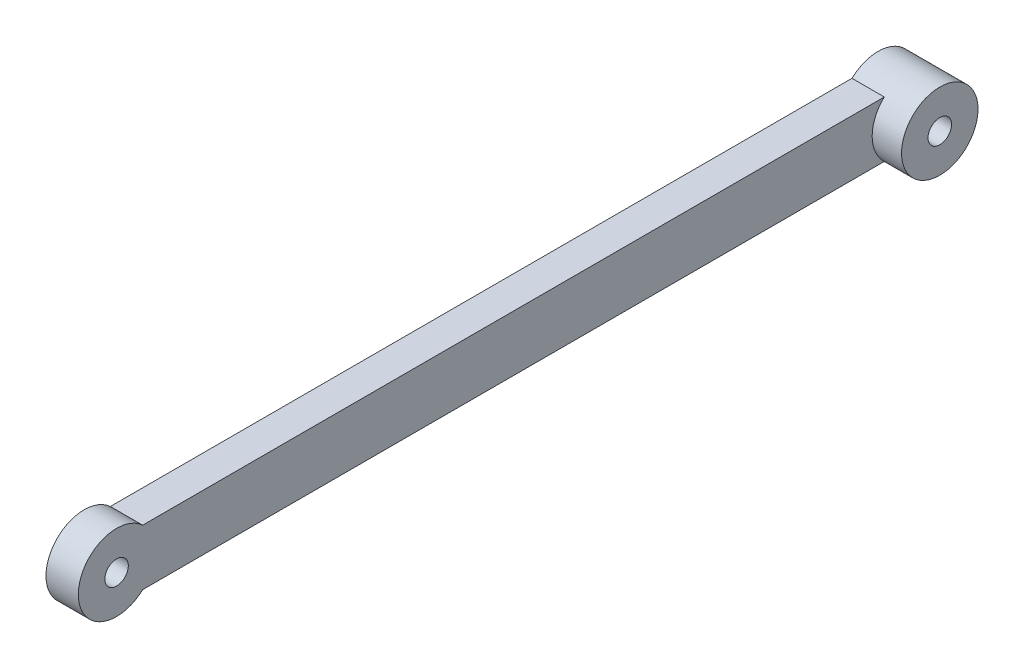
ISO-10303-21;
HEADER;
FILE_DESCRIPTION(('STEP AP214'),'2;1');
FILE_NAME('part.step','',(''),(''),'','','');
FILE_SCHEMA(('AUTOMOTIVE_DESIGN { 1 0 10303 214 1 1 1 1 }'));
ENDSEC;
DATA;
#1=APPLICATION_CONTEXT('core data for automotive mechanical design processes');
#2=APPLICATION_PROTOCOL_DEFINITION('international standard','automotive_design',2000,#1);
#3=PRODUCT_CONTEXT('',#1,'mechanical');
#4=PRODUCT('Part','Part','',(#3));
#5=PRODUCT_RELATED_PRODUCT_CATEGORY('part','',(#4));
#6=PRODUCT_DEFINITION_FORMATION('','',#4);
#7=PRODUCT_DEFINITION_CONTEXT('part definition',#1,'design');
#8=PRODUCT_DEFINITION('design','',#6,#7);
#9=PRODUCT_DEFINITION_SHAPE('','',#8);
#10=(LENGTH_UNIT() NAMED_UNIT(*) SI_UNIT(.MILLI.,.METRE.));
#11=(NAMED_UNIT(*) PLANE_ANGLE_UNIT() SI_UNIT($,.RADIAN.));
#12=(NAMED_UNIT(*) SI_UNIT($,.STERADIAN.) SOLID_ANGLE_UNIT());
#13=UNCERTAINTY_MEASURE_WITH_UNIT(LENGTH_MEASURE(1.E-05),#10,'distance_accuracy_value','');
#14=(GEOMETRIC_REPRESENTATION_CONTEXT(3) GLOBAL_UNCERTAINTY_ASSIGNED_CONTEXT((#13)) GLOBAL_UNIT_ASSIGNED_CONTEXT((#10,
#11,#12)) REPRESENTATION_CONTEXT('',''));
#15=CARTESIAN_POINT('',(0.,0.,0.));
#16=DIRECTION('',(0.,0.,1.));
#17=DIRECTION('',(1.,0.,0.));
#18=AXIS2_PLACEMENT_3D('',#15,#16,#17);
#19=CARTESIAN_POINT('',(5.5,0.,-135.));
#20=DIRECTION('',(1.,0.,0.));
#21=DIRECTION('',(0.,0.,-1.));
#22=AXIS2_PLACEMENT_3D('',#19,#20,#21);
#23=PLANE('',#22);
#24=CARTESIAN_POINT('',(5.5,0.,-135.));
#25=DIRECTION('',(1.,0.,0.));
#26=DIRECTION('',(0.,0.,-1.));
#27=AXIS2_PLACEMENT_3D('',#24,#25,#26);
#28=CIRCLE('',#27,6.50000000000002);
#29=CARTESIAN_POINT('',(5.5,4.75000000000001,-130.562940162675));
#30=VERTEX_POINT('',#29);
#31=CARTESIAN_POINT('',(5.5,-4.75,-130.562940162675));
#32=VERTEX_POINT('',#31);
#33=EDGE_CURVE('E85',#30,#32,#28,.T.);
#34=ORIENTED_EDGE('',*,*,#33,.F.);
#35=DIRECTION('',(0.,0.,1.));
#36=VECTOR('',#35,1.);
#37=CARTESIAN_POINT('',(5.5,4.75,-4.43705983732471));
#38=LINE('',#37,#36);
#39=CARTESIAN_POINT('',(5.5,4.75,-4.43705983732471));
#40=VERTEX_POINT('',#39);
#41=EDGE_CURVE('E77',#30,#40,#38,.T.);
#42=ORIENTED_EDGE('',*,*,#41,.T.);
#43=CARTESIAN_POINT('',(5.5,0.,0.));
#44=DIRECTION('',(1.,0.,0.));
#45=DIRECTION('',(0.,0.,-1.));
#46=AXIS2_PLACEMENT_3D('',#43,#44,#45);
#47=CIRCLE('',#46,6.5);
#48=CARTESIAN_POINT('',(5.5,-4.75,-4.43705983732471));
#49=VERTEX_POINT('',#48);
#50=EDGE_CURVE('E91',#40,#49,#47,.T.);
#51=ORIENTED_EDGE('',*,*,#50,.T.);
#52=DIRECTION('',(0.,0.,-1.));
#53=VECTOR('',#52,1.);
#54=CARTESIAN_POINT('',(5.5,-4.75,-4.43705983732471));
#55=LINE('',#54,#53);
#56=EDGE_CURVE('E50',#49,#32,#55,.T.);
#57=ORIENTED_EDGE('',*,*,#56,.T.);
#58=EDGE_LOOP('',(#34,#42,#51,#57));
#59=FACE_BOUND('',#58,.T.);
#60=CARTESIAN_POINT('',(5.5,0.,0.));
#61=DIRECTION('',(1.,0.,0.));
#62=DIRECTION('',(0.,0.,-1.));
#63=AXIS2_PLACEMENT_3D('',#60,#61,#62);
#64=CIRCLE('',#63,2.);
#65=CARTESIAN_POINT('',(5.5,0.,-2.));
#66=VERTEX_POINT('',#65);
#67=EDGE_CURVE('E106',#66,#66,#64,.T.);
#68=ORIENTED_EDGE('',*,*,#67,.F.);
#69=EDGE_LOOP('',(#68));
#70=FACE_BOUND('',#69,.T.);
#71=ADVANCED_FACE('F33',(#59,#70),#23,.T.);
#72=CARTESIAN_POINT('',(0.,0.,-135.));
#73=DIRECTION('',(1.,0.,0.));
#74=DIRECTION('',(0.,0.,-1.));
#75=AXIS2_PLACEMENT_3D('',#72,#73,#74);
#76=PLANE('',#75);
#77=CARTESIAN_POINT('',(0.,0.,-135.));
#78=DIRECTION('',(1.,0.,0.));
#79=DIRECTION('',(0.,0.,-1.));
#80=AXIS2_PLACEMENT_3D('',#77,#78,#79);
#81=CIRCLE('',#80,6.49999999999999);
#82=CARTESIAN_POINT('',(0.,-4.75,-130.562940162675));
#83=VERTEX_POINT('',#82);
#84=CARTESIAN_POINT('',(0.,4.75,-130.562940162675));
#85=VERTEX_POINT('',#84);
#86=EDGE_CURVE('E87',#83,#85,#81,.T.);
#87=ORIENTED_EDGE('',*,*,#86,.F.);
#88=DIRECTION('',(0.,0.,-1.));
#89=VECTOR('',#88,1.);
#90=CARTESIAN_POINT('',(0.,-4.75,-4.43705983732471));
#91=LINE('',#90,#89);
#92=CARTESIAN_POINT('',(0.,-4.75,-4.43705983732471));
#93=VERTEX_POINT('',#92);
#94=EDGE_CURVE('E73',#93,#83,#91,.T.);
#95=ORIENTED_EDGE('',*,*,#94,.F.);
#96=CARTESIAN_POINT('',(0.,0.,0.));
#97=DIRECTION('',(1.,0.,0.));
#98=DIRECTION('',(0.,0.,-1.));
#99=AXIS2_PLACEMENT_3D('',#96,#97,#98);
#100=CIRCLE('',#99,6.5);
#101=CARTESIAN_POINT('',(0.,4.75,-4.43705983732471));
#102=VERTEX_POINT('',#101);
#103=EDGE_CURVE('E68',#102,#93,#100,.T.);
#104=ORIENTED_EDGE('',*,*,#103,.F.);
#105=DIRECTION('',(0.,0.,1.));
#106=VECTOR('',#105,1.);
#107=CARTESIAN_POINT('',(0.,4.75,-4.43705983732471));
#108=LINE('',#107,#106);
#109=EDGE_CURVE('E115',#85,#102,#108,.T.);
#110=ORIENTED_EDGE('',*,*,#109,.F.);
#111=EDGE_LOOP('',(#87,#95,#104,#110));
#112=FACE_BOUND('',#111,.T.);
#113=CARTESIAN_POINT('',(0.,0.,0.));
#114=DIRECTION('',(1.,0.,0.));
#115=DIRECTION('',(0.,0.,-1.));
#116=AXIS2_PLACEMENT_3D('',#113,#114,#115);
#117=CIRCLE('',#116,2.);
#118=CARTESIAN_POINT('',(0.,0.,-2.));
#119=VERTEX_POINT('',#118);
#120=EDGE_CURVE('E105',#119,#119,#117,.T.);
#121=ORIENTED_EDGE('',*,*,#120,.T.);
#122=EDGE_LOOP('',(#121));
#123=FACE_BOUND('',#122,.T.);
#124=CARTESIAN_POINT('',(0.,0.,-135.));
#125=DIRECTION('',(1.,0.,0.));
#126=DIRECTION('',(0.,0.,-1.));
#127=AXIS2_PLACEMENT_3D('',#124,#125,#126);
#128=CIRCLE('',#127,2.);
#129=CARTESIAN_POINT('',(0.,0.,-137.));
#130=VERTEX_POINT('',#129);
#131=EDGE_CURVE('E98',#130,#130,#128,.T.);
#132=ORIENTED_EDGE('',*,*,#131,.T.);
#133=EDGE_LOOP('',(#132));
#134=FACE_BOUND('',#133,.T.);
#135=ADVANCED_FACE('F123',(#112,#123,#134),#76,.F.);
#136=CARTESIAN_POINT('',(5.5,0.,-135.));
#137=DIRECTION('',(-1.,0.,0.));
#138=DIRECTION('',(0.,0.,1.));
#139=AXIS2_PLACEMENT_3D('',#136,#137,#138);
#140=CYLINDRICAL_SURFACE('',#139,6.49999999999999);
#141=ORIENTED_EDGE('',*,*,#86,.T.);
#142=DIRECTION('',(-1.,0.,0.));
#143=VECTOR('',#142,1.);
#144=CARTESIAN_POINT('',(5.5,4.75,-130.562940162675));
#145=LINE('',#144,#143);
#146=EDGE_CURVE('E11',#30,#85,#145,.T.);
#147=ORIENTED_EDGE('',*,*,#146,.F.);
#148=ORIENTED_EDGE('',*,*,#33,.T.);
#149=DIRECTION('',(-1.,0.,0.));
#150=VECTOR('',#149,1.);
#151=CARTESIAN_POINT('',(5.5,-4.75,-130.562940162675));
#152=LINE('',#151,#150);
#153=EDGE_CURVE('E113',#32,#83,#152,.T.);
#154=ORIENTED_EDGE('',*,*,#153,.T.);
#155=EDGE_LOOP('',(#141,#147,#148,#154));
#156=FACE_BOUND('',#155,.T.);
#157=CARTESIAN_POINT('',(10.5,0.,-135.));
#158=DIRECTION('',(1.,0.,0.));
#159=DIRECTION('',(0.,0.,-1.));
#160=AXIS2_PLACEMENT_3D('',#157,#158,#159);
#161=CIRCLE('',#160,6.50000000000002);
#162=CARTESIAN_POINT('',(10.5,0.,-141.5));
#163=VERTEX_POINT('',#162);
#164=EDGE_CURVE('E94',#163,#163,#161,.T.);
#165=ORIENTED_EDGE('',*,*,#164,.F.);
#166=EDGE_LOOP('',(#165));
#167=FACE_BOUND('',#166,.T.);
#168=ADVANCED_FACE('F35',(#156,#167),#140,.T.);
#169=CARTESIAN_POINT('',(5.5,4.75,-4.43705983732471));
#170=DIRECTION('',(0.,-1.,0.));
#171=DIRECTION('',(0.,0.,-1.));
#172=AXIS2_PLACEMENT_3D('',#169,#170,#171);
#173=PLANE('',#172);
#174=ORIENTED_EDGE('',*,*,#109,.T.);
#175=DIRECTION('',(-1.,0.,0.));
#176=VECTOR('',#175,1.);
#177=CARTESIAN_POINT('',(5.5,4.75,-4.43705983732471));
#178=LINE('',#177,#176);
#179=EDGE_CURVE('E42',#40,#102,#178,.T.);
#180=ORIENTED_EDGE('',*,*,#179,.F.);
#181=ORIENTED_EDGE('',*,*,#41,.F.);
#182=ORIENTED_EDGE('',*,*,#146,.T.);
#183=EDGE_LOOP('',(#174,#180,#181,#182));
#184=FACE_BOUND('',#183,.T.);
#185=ADVANCED_FACE('F89',(#184),#173,.F.);
#186=CARTESIAN_POINT('',(5.5,0.,0.));
#187=DIRECTION('',(-1.,0.,0.));
#188=DIRECTION('',(0.,0.,1.));
#189=AXIS2_PLACEMENT_3D('',#186,#187,#188);
#190=CYLINDRICAL_SURFACE('',#189,6.5);
#191=ORIENTED_EDGE('',*,*,#103,.T.);
#192=DIRECTION('',(-1.,0.,0.));
#193=VECTOR('',#192,1.);
#194=CARTESIAN_POINT('',(5.5,-4.75,-4.43705983732471));
#195=LINE('',#194,#193);
#196=EDGE_CURVE('E120',#49,#93,#195,.T.);
#197=ORIENTED_EDGE('',*,*,#196,.F.);
#198=ORIENTED_EDGE('',*,*,#50,.F.);
#199=ORIENTED_EDGE('',*,*,#179,.T.);
#200=EDGE_LOOP('',(#191,#197,#198,#199));
#201=FACE_BOUND('',#200,.T.);
#202=ADVANCED_FACE('F121',(#201),#190,.T.);
#203=CARTESIAN_POINT('',(5.5,-4.75,-4.43705983732471));
#204=DIRECTION('',(0.,1.,0.));
#205=DIRECTION('',(0.,0.,1.));
#206=AXIS2_PLACEMENT_3D('',#203,#204,#205);
#207=PLANE('',#206);
#208=ORIENTED_EDGE('',*,*,#94,.T.);
#209=ORIENTED_EDGE('',*,*,#153,.F.);
#210=ORIENTED_EDGE('',*,*,#56,.F.);
#211=ORIENTED_EDGE('',*,*,#196,.T.);
#212=EDGE_LOOP('',(#208,#209,#210,#211));
#213=FACE_BOUND('',#212,.T.);
#214=ADVANCED_FACE('F150',(#213),#207,.F.);
#215=CARTESIAN_POINT('',(5.5,0.,0.));
#216=DIRECTION('',(-1.,0.,0.));
#217=DIRECTION('',(0.,0.,1.));
#218=AXIS2_PLACEMENT_3D('',#215,#216,#217);
#219=CYLINDRICAL_SURFACE('',#218,2.);
#220=ORIENTED_EDGE('',*,*,#67,.T.);
#221=EDGE_LOOP('',(#220));
#222=FACE_BOUND('',#221,.T.);
#223=ORIENTED_EDGE('',*,*,#120,.F.);
#224=EDGE_LOOP('',(#223));
#225=FACE_BOUND('',#224,.T.);
#226=ADVANCED_FACE('F135',(#222,#225),#219,.F.);
#227=CARTESIAN_POINT('',(5.5,0.,-135.));
#228=DIRECTION('',(-1.,0.,0.));
#229=DIRECTION('',(0.,0.,1.));
#230=AXIS2_PLACEMENT_3D('',#227,#228,#229);
#231=CYLINDRICAL_SURFACE('',#230,2.);
#232=ORIENTED_EDGE('',*,*,#131,.F.);
#233=EDGE_LOOP('',(#232));
#234=FACE_BOUND('',#233,.T.);
#235=CARTESIAN_POINT('',(10.5,0.,-135.));
#236=DIRECTION('',(1.,0.,0.));
#237=DIRECTION('',(0.,0.,-1.));
#238=AXIS2_PLACEMENT_3D('',#235,#236,#237);
#239=CIRCLE('',#238,2.);
#240=CARTESIAN_POINT('',(10.5,0.,-137.));
#241=VERTEX_POINT('',#240);
#242=EDGE_CURVE('E95',#241,#241,#239,.T.);
#243=ORIENTED_EDGE('',*,*,#242,.T.);
#244=EDGE_LOOP('',(#243));
#245=FACE_BOUND('',#244,.T.);
#246=ADVANCED_FACE('F131',(#234,#245),#231,.F.);
#247=CARTESIAN_POINT('',(10.5,0.,-135.));
#248=DIRECTION('',(1.,0.,0.));
#249=DIRECTION('',(0.,0.,-1.));
#250=AXIS2_PLACEMENT_3D('',#247,#248,#249);
#251=PLANE('',#250);
#252=ORIENTED_EDGE('',*,*,#164,.T.);
#253=EDGE_LOOP('',(#252));
#254=FACE_BOUND('',#253,.T.);
#255=ORIENTED_EDGE('',*,*,#242,.F.);
#256=EDGE_LOOP('',(#255));
#257=FACE_BOUND('',#256,.T.);
#258=ADVANCED_FACE('F134',(#254,#257),#251,.T.);
#259=CLOSED_SHELL('',(#71,#135,#168,#185,#202,#214,#226,#246,#258));
#260=MANIFOLD_SOLID_BREP('B2',#259);
#261=ADVANCED_BREP_SHAPE_REPRESENTATION('',(#18,#260),#14);
#262=SHAPE_DEFINITION_REPRESENTATION(#9,#261);
ENDSEC;
END-ISO-10303-21;
